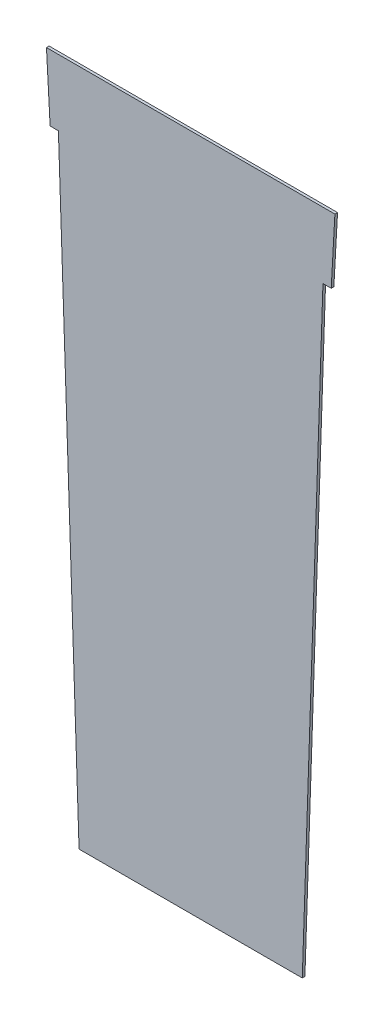
ISO-10303-21;
HEADER;
FILE_DESCRIPTION(('STEP AP214'),'2;1');
FILE_NAME('part.step','',(''),(''),'','','');
FILE_SCHEMA(('AUTOMOTIVE_DESIGN { 1 0 10303 214 1 1 1 1 }'));
ENDSEC;
DATA;
#1=APPLICATION_CONTEXT('core data for automotive mechanical design processes');
#2=APPLICATION_PROTOCOL_DEFINITION('international standard','automotive_design',2000,#1);
#3=PRODUCT_CONTEXT('',#1,'mechanical');
#4=PRODUCT('Part','Part','',(#3));
#5=PRODUCT_RELATED_PRODUCT_CATEGORY('part','',(#4));
#6=PRODUCT_DEFINITION_FORMATION('','',#4);
#7=PRODUCT_DEFINITION_CONTEXT('part definition',#1,'design');
#8=PRODUCT_DEFINITION('design','',#6,#7);
#9=PRODUCT_DEFINITION_SHAPE('','',#8);
#10=(LENGTH_UNIT() NAMED_UNIT(*) SI_UNIT(.MILLI.,.METRE.));
#11=(NAMED_UNIT(*) PLANE_ANGLE_UNIT() SI_UNIT($,.RADIAN.));
#12=(NAMED_UNIT(*) SI_UNIT($,.STERADIAN.) SOLID_ANGLE_UNIT());
#13=UNCERTAINTY_MEASURE_WITH_UNIT(LENGTH_MEASURE(1.E-05),#10,'distance_accuracy_value','');
#14=(GEOMETRIC_REPRESENTATION_CONTEXT(3) GLOBAL_UNCERTAINTY_ASSIGNED_CONTEXT((#13)) GLOBAL_UNIT_ASSIGNED_CONTEXT((#10,
#11,#12)) REPRESENTATION_CONTEXT('',''));
#15=CARTESIAN_POINT('',(0.,0.,0.));
#16=DIRECTION('',(0.,0.,1.));
#17=DIRECTION('',(1.,0.,0.));
#18=AXIS2_PLACEMENT_3D('',#15,#16,#17);
#19=CARTESIAN_POINT('',(220.862769230769,-12.2701538461537,2.032));
#20=DIRECTION('',(0.998460353205412,-0.0554700196225224,0.));
#21=DIRECTION('',(0.0554700196225225,0.998460353205413,0.));
#22=AXIS2_PLACEMENT_3D('',#19,#20,#21);
#23=PLANE('',#22);
#24=DIRECTION('',(-0.0554700196225225,-0.998460353205413,0.));
#25=VECTOR('',#24,1.);
#26=CARTESIAN_POINT('',(220.862769230769,-12.2701538461537,0.));
#27=LINE('',#26,#25);
#28=CARTESIAN_POINT('',(221.544444444444,0.,0.));
#29=VERTEX_POINT('',#28);
#30=CARTESIAN_POINT('',(218.722222222222,-50.8,0.));
#31=VERTEX_POINT('',#30);
#32=EDGE_CURVE('E128',#29,#31,#27,.T.);
#33=ORIENTED_EDGE('',*,*,#32,.F.);
#34=DIRECTION('',(0.,0.,-1.));
#35=VECTOR('',#34,1.);
#36=CARTESIAN_POINT('',(221.544444444444,0.,2.032));
#37=LINE('',#36,#35);
#38=CARTESIAN_POINT('',(221.544444444444,0.,2.032));
#39=VERTEX_POINT('',#38);
#40=EDGE_CURVE('E11',#39,#29,#37,.T.);
#41=ORIENTED_EDGE('',*,*,#40,.F.);
#42=DIRECTION('',(-0.0554700196225225,-0.998460353205413,0.));
#43=VECTOR('',#42,1.);
#44=CARTESIAN_POINT('',(220.862769230769,-12.2701538461537,2.032));
#45=LINE('',#44,#43);
#46=CARTESIAN_POINT('',(218.722222222222,-50.8,2.032));
#47=VERTEX_POINT('',#46);
#48=EDGE_CURVE('E169',#39,#47,#45,.T.);
#49=ORIENTED_EDGE('',*,*,#48,.T.);
#50=DIRECTION('',(0.,0.,-1.));
#51=VECTOR('',#50,1.);
#52=CARTESIAN_POINT('',(218.722222222222,-50.8,2.032));
#53=LINE('',#52,#51);
#54=EDGE_CURVE('E86',#47,#31,#53,.T.);
#55=ORIENTED_EDGE('',*,*,#54,.T.);
#56=EDGE_LOOP('',(#33,#41,#49,#55));
#57=FACE_BOUND('',#56,.T.);
#58=ADVANCED_FACE('F35',(#57),#23,.T.);
#59=CARTESIAN_POINT('',(0.,0.,2.032));
#60=DIRECTION('',(0.,1.,0.));
#61=DIRECTION('',(0.,0.,1.));
#62=AXIS2_PLACEMENT_3D('',#59,#60,#61);
#63=PLANE('',#62);
#64=DIRECTION('',(1.,0.,0.));
#65=VECTOR('',#64,1.);
#66=CARTESIAN_POINT('',(0.,0.,0.));
#67=LINE('',#66,#65);
#68=CARTESIAN_POINT('',(0.,0.,0.));
#69=VERTEX_POINT('',#68);
#70=EDGE_CURVE('E131',#69,#29,#67,.T.);
#71=ORIENTED_EDGE('',*,*,#70,.F.);
#72=DIRECTION('',(0.,0.,-1.));
#73=VECTOR('',#72,1.);
#74=CARTESIAN_POINT('',(0.,0.,2.032));
#75=LINE('',#74,#73);
#76=CARTESIAN_POINT('',(0.,0.,2.032));
#77=VERTEX_POINT('',#76);
#78=EDGE_CURVE('E43',#77,#69,#75,.T.);
#79=ORIENTED_EDGE('',*,*,#78,.F.);
#80=DIRECTION('',(1.,0.,0.));
#81=VECTOR('',#80,1.);
#82=CARTESIAN_POINT('',(0.,0.,2.032));
#83=LINE('',#82,#81);
#84=EDGE_CURVE('E166',#77,#39,#83,.T.);
#85=ORIENTED_EDGE('',*,*,#84,.T.);
#86=ORIENTED_EDGE('',*,*,#40,.T.);
#87=EDGE_LOOP('',(#71,#79,#85,#86));
#88=FACE_BOUND('',#87,.T.);
#89=ADVANCED_FACE('F165',(#88),#63,.T.);
#90=CARTESIAN_POINT('',(0.,0.,2.032));
#91=DIRECTION('',(0.998460353205412,0.0554700196225227,0.));
#92=DIRECTION('',(-0.0554700196225227,0.998460353205413,0.));
#93=AXIS2_PLACEMENT_3D('',#90,#91,#92);
#94=PLANE('',#93);
#95=DIRECTION('',(0.0554700196225227,-0.998460353205413,0.));
#96=VECTOR('',#95,1.);
#97=CARTESIAN_POINT('',(0.,0.,0.));
#98=LINE('',#97,#96);
#99=CARTESIAN_POINT('',(2.82222222222221,-50.8,0.));
#100=VERTEX_POINT('',#99);
#101=EDGE_CURVE('E134',#69,#100,#98,.T.);
#102=ORIENTED_EDGE('',*,*,#101,.T.);
#103=DIRECTION('',(0.,0.,-1.));
#104=VECTOR('',#103,1.);
#105=CARTESIAN_POINT('',(2.82222222222221,-50.8,2.032));
#106=LINE('',#105,#104);
#107=CARTESIAN_POINT('',(2.82222222222221,-50.8,2.032));
#108=VERTEX_POINT('',#107);
#109=EDGE_CURVE('E149',#108,#100,#106,.T.);
#110=ORIENTED_EDGE('',*,*,#109,.F.);
#111=DIRECTION('',(0.0554700196225227,-0.998460353205413,0.));
#112=VECTOR('',#111,1.);
#113=CARTESIAN_POINT('',(0.,0.,2.032));
#114=LINE('',#113,#112);
#115=EDGE_CURVE('E156',#77,#108,#114,.T.);
#116=ORIENTED_EDGE('',*,*,#115,.F.);
#117=ORIENTED_EDGE('',*,*,#78,.T.);
#118=EDGE_LOOP('',(#102,#110,#116,#117));
#119=FACE_BOUND('',#118,.T.);
#120=ADVANCED_FACE('F154',(#119),#94,.F.);
#121=CARTESIAN_POINT('',(0.,-50.8,2.032));
#122=DIRECTION('',(0.,1.,0.));
#123=DIRECTION('',(0.,0.,1.));
#124=AXIS2_PLACEMENT_3D('',#121,#122,#123);
#125=PLANE('',#124);
#126=DIRECTION('',(1.,0.,0.));
#127=VECTOR('',#126,1.);
#128=CARTESIAN_POINT('',(0.,-50.8,0.));
#129=LINE('',#128,#127);
#130=CARTESIAN_POINT('',(9.17222222222221,-50.8,0.));
#131=VERTEX_POINT('',#130);
#132=EDGE_CURVE('E136',#100,#131,#129,.T.);
#133=ORIENTED_EDGE('',*,*,#132,.T.);
#134=DIRECTION('',(0.,0.,-1.));
#135=VECTOR('',#134,1.);
#136=CARTESIAN_POINT('',(9.17222222222221,-50.8,2.032));
#137=LINE('',#136,#135);
#138=CARTESIAN_POINT('',(9.17222222222221,-50.8,2.032));
#139=VERTEX_POINT('',#138);
#140=EDGE_CURVE('E146',#139,#131,#137,.T.);
#141=ORIENTED_EDGE('',*,*,#140,.F.);
#142=DIRECTION('',(1.,0.,0.));
#143=VECTOR('',#142,1.);
#144=CARTESIAN_POINT('',(0.,-50.8,2.032));
#145=LINE('',#144,#143);
#146=EDGE_CURVE('E125',#108,#139,#145,.T.);
#147=ORIENTED_EDGE('',*,*,#146,.F.);
#148=ORIENTED_EDGE('',*,*,#109,.T.);
#149=EDGE_LOOP('',(#133,#141,#147,#148));
#150=FACE_BOUND('',#149,.T.);
#151=ADVANCED_FACE('F176',(#150),#125,.F.);
#152=CARTESIAN_POINT('',(7.44750583955289,0.251604927011922,2.032));
#153=DIRECTION('',(0.999429816012304,0.0337645208112265,0.));
#154=DIRECTION('',(-0.0337645208112265,0.999429816012304,0.));
#155=AXIS2_PLACEMENT_3D('',#152,#153,#154);
#156=PLANE('',#155);
#157=DIRECTION('',(0.0337645208112265,-0.999429816012304,0.));
#158=VECTOR('',#157,1.);
#159=CARTESIAN_POINT('',(7.44750583955289,0.251604927011922,0.));
#160=LINE('',#159,#158);
#161=CARTESIAN_POINT('',(25.0472222222222,-520.7,0.));
#162=VERTEX_POINT('',#161);
#163=EDGE_CURVE('E138',#131,#162,#160,.T.);
#164=ORIENTED_EDGE('',*,*,#163,.T.);
#165=DIRECTION('',(0.,0.,-1.));
#166=VECTOR('',#165,1.);
#167=CARTESIAN_POINT('',(25.0472222222222,-520.7,2.032));
#168=LINE('',#167,#166);
#169=CARTESIAN_POINT('',(25.0472222222222,-520.7,2.032));
#170=VERTEX_POINT('',#169);
#171=EDGE_CURVE('E119',#170,#162,#168,.T.);
#172=ORIENTED_EDGE('',*,*,#171,.F.);
#173=DIRECTION('',(0.0337645208112265,-0.999429816012304,0.));
#174=VECTOR('',#173,1.);
#175=CARTESIAN_POINT('',(7.44750583955289,0.251604927011922,2.032));
#176=LINE('',#175,#174);
#177=EDGE_CURVE('E110',#139,#170,#176,.T.);
#178=ORIENTED_EDGE('',*,*,#177,.F.);
#179=ORIENTED_EDGE('',*,*,#140,.T.);
#180=EDGE_LOOP('',(#164,#172,#178,#179));
#181=FACE_BOUND('',#180,.T.);
#182=ADVANCED_FACE('F178',(#181),#156,.F.);
#183=CARTESIAN_POINT('',(0.,-520.7,2.032));
#184=DIRECTION('',(0.,1.,0.));
#185=DIRECTION('',(0.,0.,1.));
#186=AXIS2_PLACEMENT_3D('',#183,#184,#185);
#187=PLANE('',#186);
#188=DIRECTION('',(1.,0.,0.));
#189=VECTOR('',#188,1.);
#190=CARTESIAN_POINT('',(0.,-520.7,0.));
#191=LINE('',#190,#189);
#192=CARTESIAN_POINT('',(196.497222222222,-520.7,0.));
#193=VERTEX_POINT('',#192);
#194=EDGE_CURVE('E118',#162,#193,#191,.T.);
#195=ORIENTED_EDGE('',*,*,#194,.T.);
#196=DIRECTION('',(0.,0.,-1.));
#197=VECTOR('',#196,1.);
#198=CARTESIAN_POINT('',(196.497222222222,-520.7,2.032));
#199=LINE('',#198,#197);
#200=CARTESIAN_POINT('',(196.497222222222,-520.7,2.032));
#201=VERTEX_POINT('',#200);
#202=EDGE_CURVE('E115',#201,#193,#199,.T.);
#203=ORIENTED_EDGE('',*,*,#202,.F.);
#204=DIRECTION('',(1.,0.,0.));
#205=VECTOR('',#204,1.);
#206=CARTESIAN_POINT('',(0.,-520.7,2.032));
#207=LINE('',#206,#205);
#208=EDGE_CURVE('E104',#170,#201,#207,.T.);
#209=ORIENTED_EDGE('',*,*,#208,.F.);
#210=ORIENTED_EDGE('',*,*,#171,.T.);
#211=EDGE_LOOP('',(#195,#203,#209,#210));
#212=FACE_BOUND('',#211,.T.);
#213=ADVANCED_FACE('F116',(#212),#187,.F.);
#214=CARTESIAN_POINT('',(213.844368441587,-7.22447190681036,2.032));
#215=DIRECTION('',(-0.999429816012304,0.0337645208112265,0.));
#216=DIRECTION('',(-0.0337645208112265,-0.999429816012304,0.));
#217=AXIS2_PLACEMENT_3D('',#214,#215,#216);
#218=PLANE('',#217);
#219=DIRECTION('',(0.0337645208112265,0.999429816012304,0.));
#220=VECTOR('',#219,1.);
#221=CARTESIAN_POINT('',(213.844368441587,-7.22447190681036,0.));
#222=LINE('',#221,#220);
#223=CARTESIAN_POINT('',(212.372222222222,-50.8,0.));
#224=VERTEX_POINT('',#223);
#225=EDGE_CURVE('E79',#193,#224,#222,.T.);
#226=ORIENTED_EDGE('',*,*,#225,.T.);
#227=DIRECTION('',(0.,0.,-1.));
#228=VECTOR('',#227,1.);
#229=CARTESIAN_POINT('',(212.372222222222,-50.8,2.032));
#230=LINE('',#229,#228);
#231=CARTESIAN_POINT('',(212.372222222222,-50.8,2.032));
#232=VERTEX_POINT('',#231);
#233=EDGE_CURVE('E120',#232,#224,#230,.T.);
#234=ORIENTED_EDGE('',*,*,#233,.F.);
#235=DIRECTION('',(0.0337645208112265,0.999429816012304,0.));
#236=VECTOR('',#235,1.);
#237=CARTESIAN_POINT('',(213.844368441587,-7.22447190681036,2.032));
#238=LINE('',#237,#236);
#239=EDGE_CURVE('E108',#201,#232,#238,.T.);
#240=ORIENTED_EDGE('',*,*,#239,.F.);
#241=ORIENTED_EDGE('',*,*,#202,.T.);
#242=EDGE_LOOP('',(#226,#234,#240,#241));
#243=FACE_BOUND('',#242,.T.);
#244=ADVANCED_FACE('F122',(#243),#218,.F.);
#245=EDGE_CURVE('E139',#224,#31,#129,.T.);
#246=ORIENTED_EDGE('',*,*,#245,.T.);
#247=ORIENTED_EDGE('',*,*,#54,.F.);
#248=EDGE_CURVE('E51',#232,#47,#145,.T.);
#249=ORIENTED_EDGE('',*,*,#248,.F.);
#250=ORIENTED_EDGE('',*,*,#233,.T.);
#251=EDGE_LOOP('',(#246,#247,#249,#250));
#252=FACE_BOUND('',#251,.T.);
#253=ADVANCED_FACE('F187',(#252),#125,.F.);
#254=CARTESIAN_POINT('',(0.,0.,2.032));
#255=DIRECTION('',(0.,0.,1.));
#256=DIRECTION('',(1.,0.,0.));
#257=AXIS2_PLACEMENT_3D('',#254,#255,#256);
#258=PLANE('',#257);
#259=ORIENTED_EDGE('',*,*,#48,.F.);
#260=ORIENTED_EDGE('',*,*,#84,.F.);
#261=ORIENTED_EDGE('',*,*,#115,.T.);
#262=ORIENTED_EDGE('',*,*,#146,.T.);
#263=ORIENTED_EDGE('',*,*,#177,.T.);
#264=ORIENTED_EDGE('',*,*,#208,.T.);
#265=ORIENTED_EDGE('',*,*,#239,.T.);
#266=ORIENTED_EDGE('',*,*,#248,.T.);
#267=EDGE_LOOP('',(#259,#260,#261,#262,#263,#264,#265,#266));
#268=FACE_BOUND('',#267,.T.);
#269=ADVANCED_FACE('F106',(#268),#258,.T.);
#270=CARTESIAN_POINT('',(0.,0.,0.));
#271=DIRECTION('',(0.,0.,1.));
#272=DIRECTION('',(1.,0.,0.));
#273=AXIS2_PLACEMENT_3D('',#270,#271,#272);
#274=PLANE('',#273);
#275=ORIENTED_EDGE('',*,*,#32,.T.);
#276=ORIENTED_EDGE('',*,*,#245,.F.);
#277=ORIENTED_EDGE('',*,*,#225,.F.);
#278=ORIENTED_EDGE('',*,*,#194,.F.);
#279=ORIENTED_EDGE('',*,*,#163,.F.);
#280=ORIENTED_EDGE('',*,*,#132,.F.);
#281=ORIENTED_EDGE('',*,*,#101,.F.);
#282=ORIENTED_EDGE('',*,*,#70,.T.);
#283=EDGE_LOOP('',(#275,#276,#277,#278,#279,#280,#281,#282));
#284=FACE_BOUND('',#283,.T.);
#285=ADVANCED_FACE('F163',(#284),#274,.F.);
#286=CLOSED_SHELL('',(#58,#89,#120,#151,#182,#213,#244,#253,#269,#285));
#287=MANIFOLD_SOLID_BREP('B2',#286);
#288=ADVANCED_BREP_SHAPE_REPRESENTATION('',(#18,#287),#14);
#289=SHAPE_DEFINITION_REPRESENTATION(#9,#288);
ENDSEC;
END-ISO-10303-21;
